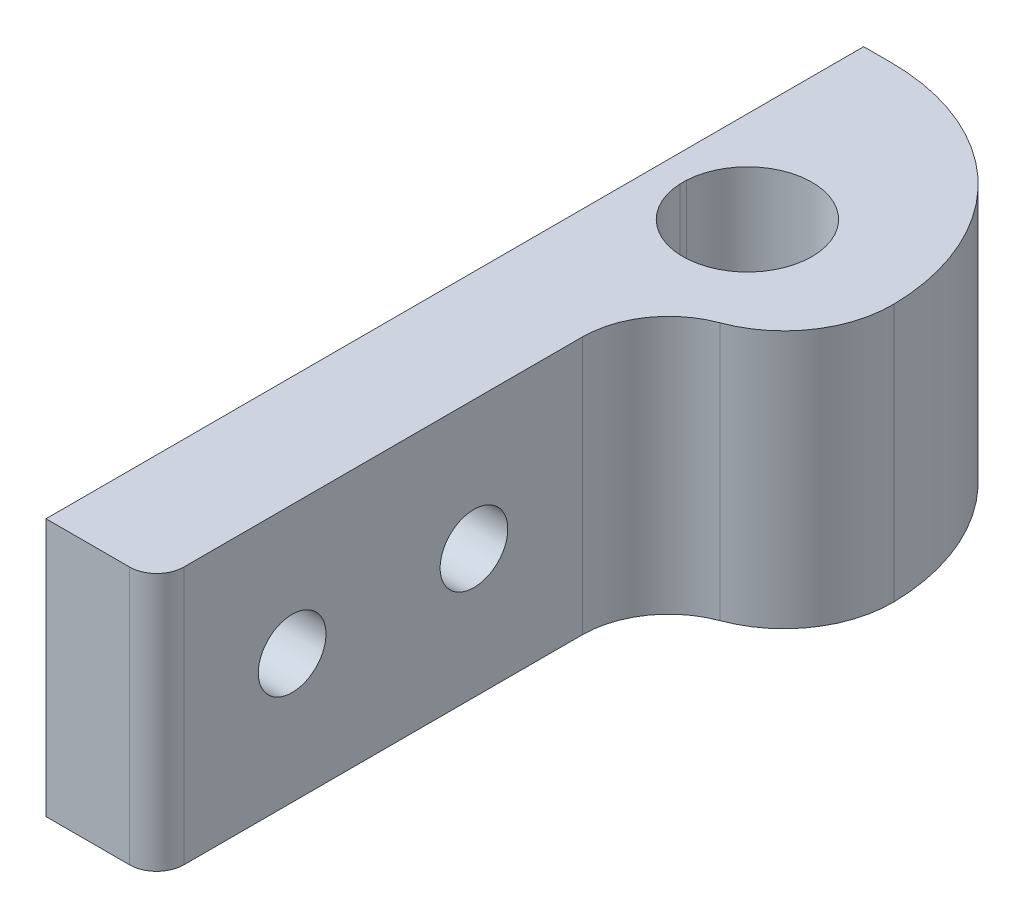
ISO-10303-21;
HEADER;
FILE_DESCRIPTION(('STEP AP214'),'2;1');
FILE_NAME('part.step','',(''),(''),'','','');
FILE_SCHEMA(('AUTOMOTIVE_DESIGN { 1 0 10303 214 1 1 1 1 }'));
ENDSEC;
DATA;
#1=APPLICATION_CONTEXT('core data for automotive mechanical design processes');
#2=APPLICATION_PROTOCOL_DEFINITION('international standard','automotive_design',2000,#1);
#3=PRODUCT_CONTEXT('',#1,'mechanical');
#4=PRODUCT('Part','Part','',(#3));
#5=PRODUCT_RELATED_PRODUCT_CATEGORY('part','',(#4));
#6=PRODUCT_DEFINITION_FORMATION('','',#4);
#7=PRODUCT_DEFINITION_CONTEXT('part definition',#1,'design');
#8=PRODUCT_DEFINITION('design','',#6,#7);
#9=PRODUCT_DEFINITION_SHAPE('','',#8);
#10=(LENGTH_UNIT() NAMED_UNIT(*) SI_UNIT(.MILLI.,.METRE.));
#11=(NAMED_UNIT(*) PLANE_ANGLE_UNIT() SI_UNIT($,.RADIAN.));
#12=(NAMED_UNIT(*) SI_UNIT($,.STERADIAN.) SOLID_ANGLE_UNIT());
#13=UNCERTAINTY_MEASURE_WITH_UNIT(LENGTH_MEASURE(1.E-05),#10,'distance_accuracy_value','');
#14=(GEOMETRIC_REPRESENTATION_CONTEXT(3) GLOBAL_UNCERTAINTY_ASSIGNED_CONTEXT((#13)) GLOBAL_UNIT_ASSIGNED_CONTEXT((#10,
#11,#12)) REPRESENTATION_CONTEXT('',''));
#15=CARTESIAN_POINT('',(0.,0.,0.));
#16=DIRECTION('',(0.,0.,1.));
#17=DIRECTION('',(1.,0.,0.));
#18=AXIS2_PLACEMENT_3D('',#15,#16,#17);
#19=CARTESIAN_POINT('',(89.4300033478893,113.35,15.5866739552852));
#20=DIRECTION('',(-1.,0.,0.));
#21=DIRECTION('',(0.,0.,1.));
#22=AXIS2_PLACEMENT_3D('',#19,#20,#21);
#23=PLANE('',#22);
#24=DIRECTION('',(0.,0.,1.));
#25=VECTOR('',#24,1.);
#26=CARTESIAN_POINT('',(89.4300033478893,118.1125,15.5866739552852));
#27=LINE('',#26,#25);
#28=CARTESIAN_POINT('',(89.4300033478893,118.1125,8.28179705698505));
#29=VERTEX_POINT('',#28);
#30=CARTESIAN_POINT('',(89.4300033478893,118.1125,8.04123043406682));
#31=VERTEX_POINT('',#30);
#32=EDGE_CURVE('E102',#29,#31,#27,.F.);
#33=ORIENTED_EDGE('',*,*,#32,.F.);
#34=DIRECTION('',(0.,1.,0.));
#35=VECTOR('',#34,1.);
#36=CARTESIAN_POINT('',(89.4300033478893,107.,8.281797056985));
#37=LINE('',#36,#35);
#38=CARTESIAN_POINT('',(89.4300033478893,108.5875,8.28179705698505));
#39=VERTEX_POINT('',#38);
#40=EDGE_CURVE('E160',#29,#39,#37,.F.);
#41=ORIENTED_EDGE('',*,*,#40,.T.);
#42=DIRECTION('',(0.,0.,1.));
#43=VECTOR('',#42,1.);
#44=CARTESIAN_POINT('',(89.4300033478893,108.5875,15.5866739552852));
#45=LINE('',#44,#43);
#46=CARTESIAN_POINT('',(89.4300033478893,108.5875,8.04123043406682));
#47=VERTEX_POINT('',#46);
#48=EDGE_CURVE('E177',#47,#39,#45,.T.);
#49=ORIENTED_EDGE('',*,*,#48,.F.);
#50=DIRECTION('',(0.,1.,0.));
#51=VECTOR('',#50,1.);
#52=CARTESIAN_POINT('',(89.4300033478893,107.,8.04123043406691));
#53=LINE('',#52,#51);
#54=EDGE_CURVE('E157',#47,#31,#53,.T.);
#55=ORIENTED_EDGE('',*,*,#54,.T.);
#56=EDGE_LOOP('',(#33,#41,#49,#55));
#57=FACE_BOUND('',#56,.T.);
#58=ADVANCED_FACE('F17',(#57),#23,.F.);
#59=CARTESIAN_POINT('',(91.518404029709,107.,29.6825924950038));
#60=DIRECTION('',(0.,1.,0.));
#61=DIRECTION('',(0.,0.,1.));
#62=AXIS2_PLACEMENT_3D('',#59,#60,#61);
#63=CYLINDRICAL_SURFACE('',#62,1.);
#64=CARTESIAN_POINT('',(91.518404029709,108.5875,29.6825924950038));
#65=DIRECTION('',(0.,1.,0.));
#66=DIRECTION('',(0.,0.,1.));
#67=AXIS2_PLACEMENT_3D('',#64,#65,#66);
#68=CIRCLE('',#67,1.);
#69=CARTESIAN_POINT('',(91.518404029709,108.5875,30.6825924950038));
#70=VERTEX_POINT('',#69);
#71=CARTESIAN_POINT('',(92.518404029709,108.5875,29.6825924950038));
#72=VERTEX_POINT('',#71);
#73=EDGE_CURVE('E128',#70,#72,#68,.T.);
#74=ORIENTED_EDGE('',*,*,#73,.T.);
#75=DIRECTION('',(0.,1.,0.));
#76=VECTOR('',#75,1.);
#77=CARTESIAN_POINT('',(92.518404029709,107.,29.6825924950038));
#78=LINE('',#77,#76);
#79=CARTESIAN_POINT('',(92.518404029709,118.1125,29.6825924950038));
#80=VERTEX_POINT('',#79);
#81=EDGE_CURVE('E99',#80,#72,#78,.F.);
#82=ORIENTED_EDGE('',*,*,#81,.F.);
#83=CARTESIAN_POINT('',(91.518404029709,118.1125,29.6825924950038));
#84=DIRECTION('',(0.,1.,0.));
#85=DIRECTION('',(0.,0.,1.));
#86=AXIS2_PLACEMENT_3D('',#83,#84,#85);
#87=CIRCLE('',#86,1.);
#88=CARTESIAN_POINT('',(91.518404029709,118.1125,30.6825924950038));
#89=VERTEX_POINT('',#88);
#90=EDGE_CURVE('E20',#80,#89,#87,.F.);
#91=ORIENTED_EDGE('',*,*,#90,.T.);
#92=DIRECTION('',(0.,1.,0.));
#93=VECTOR('',#92,1.);
#94=CARTESIAN_POINT('',(91.518404029709,107.,30.6825924950038));
#95=LINE('',#94,#93);
#96=EDGE_CURVE('E96',#70,#89,#95,.T.);
#97=ORIENTED_EDGE('',*,*,#96,.F.);
#98=EDGE_LOOP('',(#74,#82,#91,#97));
#99=FACE_BOUND('',#98,.T.);
#100=ADVANCED_FACE('F95',(#99),#63,.T.);
#101=CARTESIAN_POINT('',(95.7117083668668,107.,14.9694711276358));
#102=DIRECTION('',(0.,1.,0.));
#103=DIRECTION('',(0.,0.,1.));
#104=AXIS2_PLACEMENT_3D('',#101,#102,#103);
#105=CYLINDRICAL_SURFACE('',#104,3.19330433715774);
#106=CARTESIAN_POINT('',(95.7117083668668,118.1125,14.9694711276358));
#107=DIRECTION('',(0.,1.,0.));
#108=DIRECTION('',(0.,0.,1.));
#109=AXIS2_PLACEMENT_3D('',#106,#107,#108);
#110=CIRCLE('',#109,3.19330433715774);
#111=CARTESIAN_POINT('',(92.518404029709,118.1125,14.9694711276358));
#112=VERTEX_POINT('',#111);
#113=CARTESIAN_POINT('',(94.6058205402775,118.1125,11.9737734284825));
#114=VERTEX_POINT('',#113);
#115=EDGE_CURVE('E118',#112,#114,#110,.F.);
#116=ORIENTED_EDGE('',*,*,#115,.F.);
#117=DIRECTION('',(0.,1.,0.));
#118=VECTOR('',#117,1.);
#119=CARTESIAN_POINT('',(92.518404029709,107.,14.9694711276358));
#120=LINE('',#119,#118);
#121=CARTESIAN_POINT('',(92.518404029709,108.5875,14.9694711276358));
#122=VERTEX_POINT('',#121);
#123=EDGE_CURVE('E169',#122,#112,#120,.T.);
#124=ORIENTED_EDGE('',*,*,#123,.F.);
#125=CARTESIAN_POINT('',(95.7117083668668,108.5875,14.9694711276358));
#126=DIRECTION('',(0.,1.,0.));
#127=DIRECTION('',(0.,0.,1.));
#128=AXIS2_PLACEMENT_3D('',#125,#126,#127);
#129=CIRCLE('',#128,3.19330433715774);
#130=CARTESIAN_POINT('',(94.6058205402775,108.5875,11.9737734284825));
#131=VERTEX_POINT('',#130);
#132=EDGE_CURVE('E127',#122,#131,#129,.F.);
#133=ORIENTED_EDGE('',*,*,#132,.T.);
#134=DIRECTION('',(0.,1.,0.));
#135=VECTOR('',#134,1.);
#136=CARTESIAN_POINT('',(94.6058205402775,107.,11.9737734284825));
#137=LINE('',#136,#135);
#138=EDGE_CURVE('E101',#114,#131,#137,.F.);
#139=ORIENTED_EDGE('',*,*,#138,.F.);
#140=EDGE_LOOP('',(#116,#124,#133,#139));
#141=FACE_BOUND('',#140,.T.);
#142=ADVANCED_FACE('F209',(#141),#105,.F.);
#143=CARTESIAN_POINT('',(93.2205622500219,107.,8.22129964852372));
#144=DIRECTION('',(0.,1.,0.));
#145=DIRECTION('',(0.,0.,1.));
#146=AXIS2_PLACEMENT_3D('',#143,#144,#145);
#147=CYLINDRICAL_SURFACE('',#146,4.);
#148=CARTESIAN_POINT('',(93.2205622500219,108.5875,8.22129964852372));
#149=DIRECTION('',(0.,1.,0.));
#150=DIRECTION('',(0.,0.,1.));
#151=AXIS2_PLACEMENT_3D('',#148,#149,#150);
#152=CIRCLE('',#151,4.);
#153=CARTESIAN_POINT('',(97.2200529026379,108.5875,8.15746768445313));
#154=VERTEX_POINT('',#153);
#155=EDGE_CURVE('E197',#131,#154,#152,.T.);
#156=ORIENTED_EDGE('',*,*,#155,.T.);
#157=DIRECTION('',(0.,1.,0.));
#158=VECTOR('',#157,1.);
#159=CARTESIAN_POINT('',(97.220052902638,107.,8.15746768445314));
#160=LINE('',#159,#158);
#161=CARTESIAN_POINT('',(97.220052902638,118.1125,8.15746768445313));
#162=VERTEX_POINT('',#161);
#163=EDGE_CURVE('E163',#162,#154,#160,.F.);
#164=ORIENTED_EDGE('',*,*,#163,.F.);
#165=CARTESIAN_POINT('',(93.2205622500219,118.1125,8.22129964852372));
#166=DIRECTION('',(0.,1.,0.));
#167=DIRECTION('',(0.,0.,1.));
#168=AXIS2_PLACEMENT_3D('',#165,#166,#167);
#169=CIRCLE('',#168,4.);
#170=EDGE_CURVE('E189',#114,#162,#169,.T.);
#171=ORIENTED_EDGE('',*,*,#170,.F.);
#172=ORIENTED_EDGE('',*,*,#138,.T.);
#173=EDGE_LOOP('',(#156,#164,#171,#172));
#174=FACE_BOUND('',#173,.T.);
#175=ADVANCED_FACE('F212',(#174),#147,.T.);
#176=CARTESIAN_POINT('',(91.8082134915655,107.,8.16151374552591));
#177=DIRECTION('',(0.,1.,0.));
#178=DIRECTION('',(0.,0.,1.));
#179=AXIS2_PLACEMENT_3D('',#176,#177,#178);
#180=CYLINDRICAL_SURFACE('',#179,2.38125000000001);
#181=ORIENTED_EDGE('',*,*,#40,.F.);
#182=CARTESIAN_POINT('',(91.8082134915655,118.1125,8.16151374552591));
#183=DIRECTION('',(0.,1.,0.));
#184=DIRECTION('',(0.,0.,1.));
#185=AXIS2_PLACEMENT_3D('',#182,#183,#184);
#186=CIRCLE('',#185,2.38125000000001);
#187=EDGE_CURVE('E133',#31,#29,#186,.F.);
#188=ORIENTED_EDGE('',*,*,#187,.F.);
#189=ORIENTED_EDGE('',*,*,#54,.F.);
#190=CARTESIAN_POINT('',(91.8082134915655,108.5875,8.16151374552591));
#191=DIRECTION('',(0.,1.,0.));
#192=DIRECTION('',(0.,0.,1.));
#193=AXIS2_PLACEMENT_3D('',#190,#191,#192);
#194=CIRCLE('',#193,2.38125000000001);
#195=EDGE_CURVE('E109',#47,#39,#194,.F.);
#196=ORIENTED_EDGE('',*,*,#195,.T.);
#197=EDGE_LOOP('',(#181,#188,#189,#196));
#198=FACE_BOUND('',#197,.T.);
#199=ADVANCED_FACE('F222',(#198),#180,.F.);
#200=CARTESIAN_POINT('',(89.4300033478893,107.,8.281797056985));
#201=DIRECTION('',(0.,1.,0.));
#202=DIRECTION('',(0.,0.,1.));
#203=AXIS2_PLACEMENT_3D('',#200,#201,#202);
#204=CYLINDRICAL_SURFACE('',#203,7.79104164141833);
#205=DIRECTION('',(0.,1.,0.));
#206=VECTOR('',#205,1.);
#207=CARTESIAN_POINT('',(89.4300033478893,119.7,0.490755415566666));
#208=LINE('',#207,#206);
#209=CARTESIAN_POINT('',(89.4300033478893,118.1125,0.490755415566666));
#210=VERTEX_POINT('',#209);
#211=CARTESIAN_POINT('',(89.4300033478893,108.5875,0.490755415566668));
#212=VERTEX_POINT('',#211);
#213=EDGE_CURVE('E129',#210,#212,#208,.F.);
#214=ORIENTED_EDGE('',*,*,#213,.F.);
#215=CARTESIAN_POINT('',(89.4300033478893,118.1125,8.281797056985));
#216=DIRECTION('',(0.,1.,0.));
#217=DIRECTION('',(0.,0.,1.));
#218=AXIS2_PLACEMENT_3D('',#215,#216,#217);
#219=CIRCLE('',#218,7.79104164141833);
#220=EDGE_CURVE('E187',#162,#210,#219,.T.);
#221=ORIENTED_EDGE('',*,*,#220,.F.);
#222=ORIENTED_EDGE('',*,*,#163,.T.);
#223=CARTESIAN_POINT('',(89.4300033478893,108.5875,8.281797056985));
#224=DIRECTION('',(0.,1.,0.));
#225=DIRECTION('',(0.,0.,1.));
#226=AXIS2_PLACEMENT_3D('',#223,#224,#225);
#227=CIRCLE('',#226,7.79104164141833);
#228=EDGE_CURVE('E195',#154,#212,#227,.T.);
#229=ORIENTED_EDGE('',*,*,#228,.T.);
#230=EDGE_LOOP('',(#214,#221,#222,#229));
#231=FACE_BOUND('',#230,.T.);
#232=ADVANCED_FACE('F220',(#231),#204,.T.);
#233=CARTESIAN_POINT('',(92.518404029709,107.,30.6825924950038));
#234=DIRECTION('',(1.,0.,0.));
#235=DIRECTION('',(0.,0.,-1.));
#236=AXIS2_PLACEMENT_3D('',#233,#234,#235);
#237=PLANE('',#236);
#238=CARTESIAN_POINT('',(92.518404029709,113.35,18.9694711276358));
#239=DIRECTION('',(-1.,0.,0.));
#240=DIRECTION('',(0.,0.,1.));
#241=AXIS2_PLACEMENT_3D('',#238,#239,#240);
#242=CIRCLE('',#241,1.25);
#243=CARTESIAN_POINT('',(92.518404029709,113.35,20.2194711276358));
#244=VERTEX_POINT('',#243);
#245=EDGE_CURVE('E154',#244,#244,#242,.T.);
#246=ORIENTED_EDGE('',*,*,#245,.T.);
#247=EDGE_LOOP('',(#246));
#248=FACE_BOUND('',#247,.T.);
#249=CARTESIAN_POINT('',(92.518404029709,113.35,25.6825924950038));
#250=DIRECTION('',(-1.,0.,0.));
#251=DIRECTION('',(0.,0.,1.));
#252=AXIS2_PLACEMENT_3D('',#249,#250,#251);
#253=CIRCLE('',#252,1.25);
#254=CARTESIAN_POINT('',(92.518404029709,113.35,26.9325924950038));
#255=VERTEX_POINT('',#254);
#256=EDGE_CURVE('E135',#255,#255,#253,.T.);
#257=ORIENTED_EDGE('',*,*,#256,.T.);
#258=EDGE_LOOP('',(#257));
#259=FACE_BOUND('',#258,.T.);
#260=ORIENTED_EDGE('',*,*,#123,.T.);
#261=DIRECTION('',(0.,0.,1.));
#262=VECTOR('',#261,1.);
#263=CARTESIAN_POINT('',(92.518404029709,118.1125,15.5866739552852));
#264=LINE('',#263,#262);
#265=EDGE_CURVE('E116',#80,#112,#264,.F.);
#266=ORIENTED_EDGE('',*,*,#265,.F.);
#267=ORIENTED_EDGE('',*,*,#81,.T.);
#268=DIRECTION('',(0.,0.,1.));
#269=VECTOR('',#268,1.);
#270=CARTESIAN_POINT('',(92.518404029709,108.5875,15.5866739552852));
#271=LINE('',#270,#269);
#272=EDGE_CURVE('E124',#72,#122,#271,.F.);
#273=ORIENTED_EDGE('',*,*,#272,.T.);
#274=EDGE_LOOP('',(#260,#266,#267,#273));
#275=FACE_BOUND('',#274,.T.);
#276=ADVANCED_FACE('F202',(#248,#259,#275),#237,.T.);
#277=CARTESIAN_POINT('',(93.3255241685984,108.5875,15.5866739552852));
#278=DIRECTION('',(0.,1.,0.));
#279=DIRECTION('',(0.,0.,1.));
#280=AXIS2_PLACEMENT_3D('',#277,#278,#279);
#281=PLANE('',#280);
#282=ORIENTED_EDGE('',*,*,#195,.F.);
#283=ORIENTED_EDGE('',*,*,#48,.T.);
#284=EDGE_LOOP('',(#282,#283));
#285=FACE_BOUND('',#284,.T.);
#286=ORIENTED_EDGE('',*,*,#155,.F.);
#287=ORIENTED_EDGE('',*,*,#132,.F.);
#288=ORIENTED_EDGE('',*,*,#272,.F.);
#289=ORIENTED_EDGE('',*,*,#73,.F.);
#290=DIRECTION('',(1.,0.,0.));
#291=VECTOR('',#290,1.);
#292=CARTESIAN_POINT('',(89.4300033478892,108.5875,30.6825924950038));
#293=LINE('',#292,#291);
#294=CARTESIAN_POINT('',(88.4300033478893,108.5875,30.6825924950038));
#295=VERTEX_POINT('',#294);
#296=EDGE_CURVE('E108',#295,#70,#293,.T.);
#297=ORIENTED_EDGE('',*,*,#296,.F.);
#298=DIRECTION('',(0.,0.,1.));
#299=VECTOR('',#298,1.);
#300=CARTESIAN_POINT('',(88.4300033478893,108.5875,15.5866739552853));
#301=LINE('',#300,#299);
#302=CARTESIAN_POINT('',(88.4300033478893,108.5875,0.490755415566672));
#303=VERTEX_POINT('',#302);
#304=EDGE_CURVE('E151',#303,#295,#301,.T.);
#305=ORIENTED_EDGE('',*,*,#304,.F.);
#306=DIRECTION('',(-1.,0.,0.));
#307=VECTOR('',#306,1.);
#308=CARTESIAN_POINT('',(89.4300033478893,108.5875,0.490755415566667));
#309=LINE('',#308,#307);
#310=EDGE_CURVE('E132',#212,#303,#309,.T.);
#311=ORIENTED_EDGE('',*,*,#310,.F.);
#312=ORIENTED_EDGE('',*,*,#228,.F.);
#313=EDGE_LOOP('',(#286,#287,#288,#289,#297,#305,#311,#312));
#314=FACE_BOUND('',#313,.T.);
#315=ADVANCED_FACE('F205',(#285,#314),#281,.F.);
#316=CARTESIAN_POINT('',(89.4300033478892,107.,30.6825924950038));
#317=DIRECTION('',(0.,0.,1.));
#318=DIRECTION('',(1.,0.,0.));
#319=AXIS2_PLACEMENT_3D('',#316,#317,#318);
#320=PLANE('',#319);
#321=DIRECTION('',(0.,1.,0.));
#322=VECTOR('',#321,1.);
#323=CARTESIAN_POINT('',(88.4300033478893,113.35,30.6825924950038));
#324=LINE('',#323,#322);
#325=CARTESIAN_POINT('',(88.4300033478893,118.1125,30.6825924950038));
#326=VERTEX_POINT('',#325);
#327=EDGE_CURVE('E144',#295,#326,#324,.T.);
#328=ORIENTED_EDGE('',*,*,#327,.F.);
#329=ORIENTED_EDGE('',*,*,#296,.T.);
#330=ORIENTED_EDGE('',*,*,#96,.T.);
#331=DIRECTION('',(1.,0.,0.));
#332=VECTOR('',#331,1.);
#333=CARTESIAN_POINT('',(93.3255241685984,118.1125,30.6825924950038));
#334=LINE('',#333,#332);
#335=EDGE_CURVE('E107',#326,#89,#334,.T.);
#336=ORIENTED_EDGE('',*,*,#335,.F.);
#337=EDGE_LOOP('',(#328,#329,#330,#336));
#338=FACE_BOUND('',#337,.T.);
#339=ADVANCED_FACE('F106',(#338),#320,.T.);
#340=CARTESIAN_POINT('',(93.3255241685984,118.1125,15.5866739552852));
#341=DIRECTION('',(0.,1.,0.));
#342=DIRECTION('',(0.,0.,1.));
#343=AXIS2_PLACEMENT_3D('',#340,#341,#342);
#344=PLANE('',#343);
#345=ORIENTED_EDGE('',*,*,#187,.T.);
#346=ORIENTED_EDGE('',*,*,#32,.T.);
#347=EDGE_LOOP('',(#345,#346));
#348=FACE_BOUND('',#347,.T.);
#349=ORIENTED_EDGE('',*,*,#170,.T.);
#350=ORIENTED_EDGE('',*,*,#220,.T.);
#351=DIRECTION('',(-1.,0.,0.));
#352=VECTOR('',#351,1.);
#353=CARTESIAN_POINT('',(89.4300033478893,118.1125,0.490755415566666));
#354=LINE('',#353,#352);
#355=CARTESIAN_POINT('',(88.4300033478893,118.1125,0.490755415566671));
#356=VERTEX_POINT('',#355);
#357=EDGE_CURVE('E35',#356,#210,#354,.F.);
#358=ORIENTED_EDGE('',*,*,#357,.F.);
#359=DIRECTION('',(0.,0.,1.));
#360=VECTOR('',#359,1.);
#361=CARTESIAN_POINT('',(88.4300033478893,118.1125,15.5866739552853));
#362=LINE('',#361,#360);
#363=EDGE_CURVE('E114',#326,#356,#362,.F.);
#364=ORIENTED_EDGE('',*,*,#363,.F.);
#365=ORIENTED_EDGE('',*,*,#335,.T.);
#366=ORIENTED_EDGE('',*,*,#90,.F.);
#367=ORIENTED_EDGE('',*,*,#265,.T.);
#368=ORIENTED_EDGE('',*,*,#115,.T.);
#369=EDGE_LOOP('',(#349,#350,#358,#364,#365,#366,#367,#368));
#370=FACE_BOUND('',#369,.T.);
#371=ADVANCED_FACE('F112',(#348,#370),#344,.T.);
#372=CARTESIAN_POINT('',(89.4300033478893,119.7,0.490755415566666));
#373=DIRECTION('',(0.,0.,-1.));
#374=DIRECTION('',(-1.,0.,0.));
#375=AXIS2_PLACEMENT_3D('',#372,#373,#374);
#376=PLANE('',#375);
#377=DIRECTION('',(0.,1.,0.));
#378=VECTOR('',#377,1.);
#379=CARTESIAN_POINT('',(88.4300033478893,113.35,0.490755415566672));
#380=LINE('',#379,#378);
#381=EDGE_CURVE('E138',#356,#303,#380,.F.);
#382=ORIENTED_EDGE('',*,*,#381,.F.);
#383=ORIENTED_EDGE('',*,*,#357,.T.);
#384=ORIENTED_EDGE('',*,*,#213,.T.);
#385=ORIENTED_EDGE('',*,*,#310,.T.);
#386=EDGE_LOOP('',(#382,#383,#384,#385));
#387=FACE_BOUND('',#386,.T.);
#388=ADVANCED_FACE('F216',(#387),#376,.T.);
#389=CARTESIAN_POINT('',(87.518404029709,113.35,25.6825924950038));
#390=DIRECTION('',(-1.,0.,0.));
#391=DIRECTION('',(0.,0.,1.));
#392=AXIS2_PLACEMENT_3D('',#389,#390,#391);
#393=CYLINDRICAL_SURFACE('',#392,1.25);
#394=ORIENTED_EDGE('',*,*,#256,.F.);
#395=EDGE_LOOP('',(#394));
#396=FACE_BOUND('',#395,.T.);
#397=CARTESIAN_POINT('',(88.4300033478893,113.35,25.6825924950038));
#398=DIRECTION('',(-1.,0.,0.));
#399=DIRECTION('',(0.,0.,1.));
#400=AXIS2_PLACEMENT_3D('',#397,#398,#399);
#401=CIRCLE('',#400,1.25);
#402=CARTESIAN_POINT('',(88.4300033478893,113.35,26.9325924950038));
#403=VERTEX_POINT('',#402);
#404=EDGE_CURVE('E26',#403,#403,#401,.F.);
#405=ORIENTED_EDGE('',*,*,#404,.F.);
#406=EDGE_LOOP('',(#405));
#407=FACE_BOUND('',#406,.T.);
#408=ADVANCED_FACE('F240',(#396,#407),#393,.F.);
#409=CARTESIAN_POINT('',(87.518404029709,113.35,18.9694711276358));
#410=DIRECTION('',(-1.,0.,0.));
#411=DIRECTION('',(0.,0.,1.));
#412=AXIS2_PLACEMENT_3D('',#409,#410,#411);
#413=CYLINDRICAL_SURFACE('',#412,1.25);
#414=ORIENTED_EDGE('',*,*,#245,.F.);
#415=EDGE_LOOP('',(#414));
#416=FACE_BOUND('',#415,.T.);
#417=CARTESIAN_POINT('',(88.4300033478893,113.35,18.9694711276358));
#418=DIRECTION('',(-1.,0.,0.));
#419=DIRECTION('',(0.,0.,1.));
#420=AXIS2_PLACEMENT_3D('',#417,#418,#419);
#421=CIRCLE('',#420,1.25);
#422=CARTESIAN_POINT('',(88.4300033478893,113.35,20.2194711276358));
#423=VERTEX_POINT('',#422);
#424=EDGE_CURVE('E11',#423,#423,#421,.F.);
#425=ORIENTED_EDGE('',*,*,#424,.F.);
#426=EDGE_LOOP('',(#425));
#427=FACE_BOUND('',#426,.T.);
#428=ADVANCED_FACE('F234',(#416,#427),#413,.F.);
#429=CARTESIAN_POINT('',(88.4300033478893,113.35,15.5866739552853));
#430=DIRECTION('',(-1.,0.,0.));
#431=DIRECTION('',(0.,0.,1.));
#432=AXIS2_PLACEMENT_3D('',#429,#430,#431);
#433=PLANE('',#432);
#434=ORIENTED_EDGE('',*,*,#424,.T.);
#435=EDGE_LOOP('',(#434));
#436=FACE_BOUND('',#435,.T.);
#437=ORIENTED_EDGE('',*,*,#404,.T.);
#438=EDGE_LOOP('',(#437));
#439=FACE_BOUND('',#438,.T.);
#440=ORIENTED_EDGE('',*,*,#363,.T.);
#441=ORIENTED_EDGE('',*,*,#381,.T.);
#442=ORIENTED_EDGE('',*,*,#304,.T.);
#443=ORIENTED_EDGE('',*,*,#327,.T.);
#444=EDGE_LOOP('',(#440,#441,#442,#443));
#445=FACE_BOUND('',#444,.T.);
#446=ADVANCED_FACE('F219',(#436,#439,#445),#433,.T.);
#447=CLOSED_SHELL('',(#58,#100,#142,#175,#199,#232,#276,#315,#339,#371,#388,#408,#428,#446));
#448=MANIFOLD_SOLID_BREP('B1',#447);
#449=ADVANCED_BREP_SHAPE_REPRESENTATION('',(#18,#448),#14);
#450=SHAPE_DEFINITION_REPRESENTATION(#9,#449);
ENDSEC;
END-ISO-10303-21;
